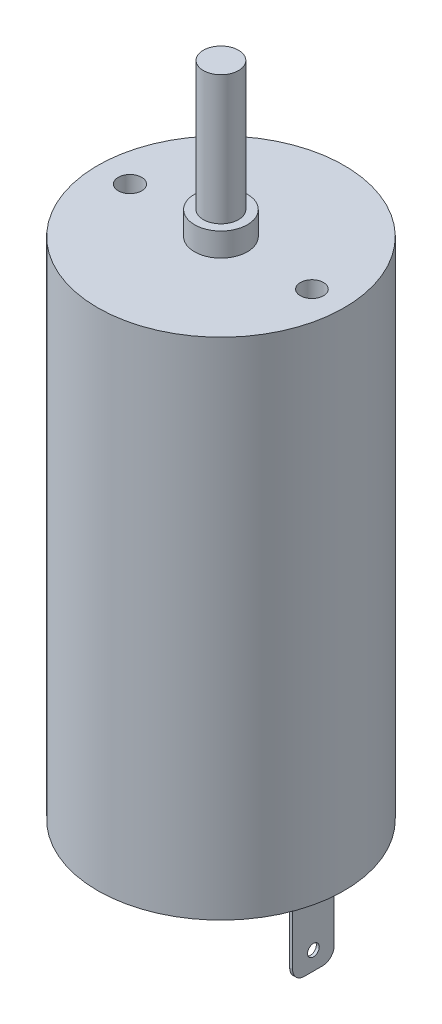
ISO-10303-21;
HEADER;
FILE_DESCRIPTION(('STEP AP214'),'2;1');
FILE_NAME('part.step','',(''),(''),'','','');
FILE_SCHEMA(('AUTOMOTIVE_DESIGN { 1 0 10303 214 1 1 1 1 }'));
ENDSEC;
DATA;
#1=APPLICATION_CONTEXT('core data for automotive mechanical design processes');
#2=APPLICATION_PROTOCOL_DEFINITION('international standard','automotive_design',2000,#1);
#3=PRODUCT_CONTEXT('',#1,'mechanical');
#4=PRODUCT('Part','Part','',(#3));
#5=PRODUCT_RELATED_PRODUCT_CATEGORY('part','',(#4));
#6=PRODUCT_DEFINITION_FORMATION('','',#4);
#7=PRODUCT_DEFINITION_CONTEXT('part definition',#1,'design');
#8=PRODUCT_DEFINITION('design','',#6,#7);
#9=PRODUCT_DEFINITION_SHAPE('','',#8);
#10=(LENGTH_UNIT() NAMED_UNIT(*) SI_UNIT(.MILLI.,.METRE.));
#11=(NAMED_UNIT(*) PLANE_ANGLE_UNIT() SI_UNIT($,.RADIAN.));
#12=(NAMED_UNIT(*) SI_UNIT($,.STERADIAN.) SOLID_ANGLE_UNIT());
#13=UNCERTAINTY_MEASURE_WITH_UNIT(LENGTH_MEASURE(1.E-05),#10,'distance_accuracy_value','');
#14=(GEOMETRIC_REPRESENTATION_CONTEXT(3) GLOBAL_UNCERTAINTY_ASSIGNED_CONTEXT((#13)) GLOBAL_UNIT_ASSIGNED_CONTEXT((#10,
#11,#12)) REPRESENTATION_CONTEXT('',''));
#15=CARTESIAN_POINT('',(0.,0.,0.));
#16=DIRECTION('',(0.,0.,1.));
#17=DIRECTION('',(1.,0.,0.));
#18=AXIS2_PLACEMENT_3D('',#15,#16,#17);
#19=CARTESIAN_POINT('',(0.,-1.25,0.));
#20=DIRECTION('',(0.,-1.,0.));
#21=DIRECTION('',(0.,0.,-1.));
#22=AXIS2_PLACEMENT_3D('',#19,#20,#21);
#23=PLANE('',#22);
#24=DIRECTION('',(-1.,0.,0.));
#25=VECTOR('',#24,1.);
#26=CARTESIAN_POINT('',(7.625,-1.25,1.77));
#27=LINE('',#26,#25);
#28=CARTESIAN_POINT('',(7.875,-1.25,1.77));
#29=VERTEX_POINT('',#28);
#30=CARTESIAN_POINT('',(7.625,-1.25,1.77));
#31=VERTEX_POINT('',#30);
#32=EDGE_CURVE('E192',#29,#31,#27,.T.);
#33=ORIENTED_EDGE('',*,*,#32,.F.);
#34=DIRECTION('',(0.,0.,1.));
#35=VECTOR('',#34,1.);
#36=CARTESIAN_POINT('',(7.875,-1.25,-2.));
#37=LINE('',#36,#35);
#38=CARTESIAN_POINT('',(7.875,-1.25,2.));
#39=VERTEX_POINT('',#38);
#40=EDGE_CURVE('E188',#29,#39,#37,.T.);
#41=ORIENTED_EDGE('',*,*,#40,.T.);
#42=DIRECTION('',(-1.,0.,0.));
#43=VECTOR('',#42,1.);
#44=CARTESIAN_POINT('',(7.875,-1.25,2.));
#45=LINE('',#44,#43);
#46=CARTESIAN_POINT('',(7.625,-1.25,2.));
#47=VERTEX_POINT('',#46);
#48=EDGE_CURVE('E187',#39,#47,#45,.T.);
#49=ORIENTED_EDGE('',*,*,#48,.T.);
#50=DIRECTION('',(0.,0.,-1.));
#51=VECTOR('',#50,1.);
#52=CARTESIAN_POINT('',(7.625,-1.25,-2.));
#53=LINE('',#52,#51);
#54=EDGE_CURVE('E270',#47,#31,#53,.T.);
#55=ORIENTED_EDGE('',*,*,#54,.T.);
#56=EDGE_LOOP('',(#33,#41,#49,#55));
#57=FACE_BOUND('',#56,.T.);
#58=ADVANCED_FACE('F33',(#57),#23,.T.);
#59=CARTESIAN_POINT('',(0.,-1.25,0.));
#60=DIRECTION('',(0.,-1.,0.));
#61=DIRECTION('',(0.,0.,-1.));
#62=AXIS2_PLACEMENT_3D('',#59,#60,#61);
#63=PLANE('',#62);
#64=DIRECTION('',(1.,0.,0.));
#65=VECTOR('',#64,1.);
#66=CARTESIAN_POINT('',(-7.625,-1.25,-1.775));
#67=LINE('',#66,#65);
#68=CARTESIAN_POINT('',(-7.875,-1.25,-1.775));
#69=VERTEX_POINT('',#68);
#70=CARTESIAN_POINT('',(-7.625,-1.25,-1.775));
#71=VERTEX_POINT('',#70);
#72=EDGE_CURVE('E217',#69,#71,#67,.T.);
#73=ORIENTED_EDGE('',*,*,#72,.F.);
#74=DIRECTION('',(0.,0.,-1.));
#75=VECTOR('',#74,1.);
#76=CARTESIAN_POINT('',(-7.875,-1.25,-2.));
#77=LINE('',#76,#75);
#78=CARTESIAN_POINT('',(-7.875,-1.25,-2.));
#79=VERTEX_POINT('',#78);
#80=EDGE_CURVE('E238',#69,#79,#77,.T.);
#81=ORIENTED_EDGE('',*,*,#80,.T.);
#82=DIRECTION('',(1.,0.,0.));
#83=VECTOR('',#82,1.);
#84=CARTESIAN_POINT('',(-7.625,-1.25,-2.));
#85=LINE('',#84,#83);
#86=CARTESIAN_POINT('',(-7.625,-1.25,-2.));
#87=VERTEX_POINT('',#86);
#88=EDGE_CURVE('E237',#79,#87,#85,.T.);
#89=ORIENTED_EDGE('',*,*,#88,.T.);
#90=DIRECTION('',(0.,0.,1.));
#91=VECTOR('',#90,1.);
#92=CARTESIAN_POINT('',(-7.625,-1.25,-2.));
#93=LINE('',#92,#91);
#94=EDGE_CURVE('E241',#87,#71,#93,.T.);
#95=ORIENTED_EDGE('',*,*,#94,.T.);
#96=EDGE_LOOP('',(#73,#81,#89,#95));
#97=FACE_BOUND('',#96,.T.);
#98=ADVANCED_FACE('F399',(#97),#63,.T.);
#99=CARTESIAN_POINT('',(0.,0.,0.));
#100=DIRECTION('',(0.,1.,0.));
#101=DIRECTION('',(0.,0.,1.));
#102=AXIS2_PLACEMENT_3D('',#99,#100,#101);
#103=PLANE('',#102);
#104=DIRECTION('',(0.,0.,-1.));
#105=VECTOR('',#104,1.);
#106=CARTESIAN_POINT('',(7.625,0.,-2.));
#107=LINE('',#106,#105);
#108=CARTESIAN_POINT('',(7.625,0.,2.));
#109=VERTEX_POINT('',#108);
#110=CARTESIAN_POINT('',(7.625,0.,-2.));
#111=VERTEX_POINT('',#110);
#112=EDGE_CURVE('E269',#109,#111,#107,.T.);
#113=ORIENTED_EDGE('',*,*,#112,.F.);
#114=DIRECTION('',(-1.,0.,0.));
#115=VECTOR('',#114,1.);
#116=CARTESIAN_POINT('',(7.875,0.,2.));
#117=LINE('',#116,#115);
#118=CARTESIAN_POINT('',(7.875,0.,2.));
#119=VERTEX_POINT('',#118);
#120=EDGE_CURVE('E285',#119,#109,#117,.T.);
#121=ORIENTED_EDGE('',*,*,#120,.F.);
#122=DIRECTION('',(0.,0.,1.));
#123=VECTOR('',#122,1.);
#124=CARTESIAN_POINT('',(7.875,0.,-2.));
#125=LINE('',#124,#123);
#126=CARTESIAN_POINT('',(7.875,0.,-2.));
#127=VERTEX_POINT('',#126);
#128=EDGE_CURVE('E282',#127,#119,#125,.T.);
#129=ORIENTED_EDGE('',*,*,#128,.F.);
#130=DIRECTION('',(1.,0.,0.));
#131=VECTOR('',#130,1.);
#132=CARTESIAN_POINT('',(7.875,0.,-2.));
#133=LINE('',#132,#131);
#134=EDGE_CURVE('E279',#111,#127,#133,.T.);
#135=ORIENTED_EDGE('',*,*,#134,.F.);
#136=EDGE_LOOP('',(#113,#121,#129,#135));
#137=FACE_BOUND('',#136,.T.);
#138=CARTESIAN_POINT('',(0.,0.,0.));
#139=DIRECTION('',(0.,1.,0.));
#140=DIRECTION('',(0.,0.,1.));
#141=AXIS2_PLACEMENT_3D('',#138,#139,#140);
#142=CIRCLE('',#141,10.5);
#143=CARTESIAN_POINT('',(0.,0.,10.5));
#144=VERTEX_POINT('',#143);
#145=EDGE_CURVE('E320',#144,#144,#142,.T.);
#146=ORIENTED_EDGE('',*,*,#145,.F.);
#147=EDGE_LOOP('',(#146));
#148=FACE_BOUND('',#147,.T.);
#149=DIRECTION('',(0.,0.,-1.));
#150=VECTOR('',#149,1.);
#151=CARTESIAN_POINT('',(-7.875,0.,-2.));
#152=LINE('',#151,#150);
#153=CARTESIAN_POINT('',(-7.875,0.,2.));
#154=VERTEX_POINT('',#153);
#155=CARTESIAN_POINT('',(-7.875,0.,-2.));
#156=VERTEX_POINT('',#155);
#157=EDGE_CURVE('E233',#154,#156,#152,.T.);
#158=ORIENTED_EDGE('',*,*,#157,.F.);
#159=DIRECTION('',(-1.,0.,0.));
#160=VECTOR('',#159,1.);
#161=CARTESIAN_POINT('',(-7.625,0.,2.));
#162=LINE('',#161,#160);
#163=CARTESIAN_POINT('',(-7.625,0.,2.));
#164=VERTEX_POINT('',#163);
#165=EDGE_CURVE('E255',#164,#154,#162,.T.);
#166=ORIENTED_EDGE('',*,*,#165,.F.);
#167=DIRECTION('',(0.,0.,1.));
#168=VECTOR('',#167,1.);
#169=CARTESIAN_POINT('',(-7.625,0.,-2.));
#170=LINE('',#169,#168);
#171=CARTESIAN_POINT('',(-7.625,0.,-2.));
#172=VERTEX_POINT('',#171);
#173=EDGE_CURVE('E252',#172,#164,#170,.T.);
#174=ORIENTED_EDGE('',*,*,#173,.F.);
#175=DIRECTION('',(1.,0.,0.));
#176=VECTOR('',#175,1.);
#177=CARTESIAN_POINT('',(-7.625,0.,-2.));
#178=LINE('',#177,#176);
#179=EDGE_CURVE('E249',#156,#172,#178,.T.);
#180=ORIENTED_EDGE('',*,*,#179,.F.);
#181=EDGE_LOOP('',(#158,#166,#174,#180));
#182=FACE_BOUND('',#181,.T.);
#183=ADVANCED_FACE('F383',(#137,#148,#182),#103,.F.);
#184=CARTESIAN_POINT('',(0.,43.,0.));
#185=DIRECTION('',(0.,-1.,0.));
#186=DIRECTION('',(0.,0.,-1.));
#187=AXIS2_PLACEMENT_3D('',#184,#185,#186);
#188=CYLINDRICAL_SURFACE('',#187,10.5);
#189=CARTESIAN_POINT('',(0.,43.,0.));
#190=DIRECTION('',(0.,1.,0.));
#191=DIRECTION('',(0.,0.,1.));
#192=AXIS2_PLACEMENT_3D('',#189,#190,#191);
#193=CIRCLE('',#192,10.5);
#194=CARTESIAN_POINT('',(0.,43.,10.5));
#195=VERTEX_POINT('',#194);
#196=EDGE_CURVE('E321',#195,#195,#193,.T.);
#197=ORIENTED_EDGE('',*,*,#196,.F.);
#198=EDGE_LOOP('',(#197));
#199=FACE_BOUND('',#198,.T.);
#200=ORIENTED_EDGE('',*,*,#145,.T.);
#201=EDGE_LOOP('',(#200));
#202=FACE_BOUND('',#201,.T.);
#203=ADVANCED_FACE('F606',(#199,#202),#188,.T.);
#204=CARTESIAN_POINT('',(0.,43.,0.));
#205=DIRECTION('',(0.,1.,0.));
#206=DIRECTION('',(0.,0.,1.));
#207=AXIS2_PLACEMENT_3D('',#204,#205,#206);
#208=PLANE('',#207);
#209=CARTESIAN_POINT('',(7.75,43.,0.));
#210=DIRECTION('',(0.,1.,0.));
#211=DIRECTION('',(0.,0.,1.));
#212=AXIS2_PLACEMENT_3D('',#209,#210,#211);
#213=CIRCLE('',#212,0.983949460404674);
#214=CARTESIAN_POINT('',(7.75,43.,0.983949460404674));
#215=VERTEX_POINT('',#214);
#216=EDGE_CURVE('E303',#215,#215,#213,.T.);
#217=ORIENTED_EDGE('',*,*,#216,.F.);
#218=EDGE_LOOP('',(#217));
#219=FACE_BOUND('',#218,.T.);
#220=CARTESIAN_POINT('',(-7.75,43.,0.));
#221=DIRECTION('',(0.,1.,0.));
#222=DIRECTION('',(0.,0.,1.));
#223=AXIS2_PLACEMENT_3D('',#220,#221,#222);
#224=CIRCLE('',#223,1.);
#225=CARTESIAN_POINT('',(-7.75,43.,1.));
#226=VERTEX_POINT('',#225);
#227=EDGE_CURVE('E298',#226,#226,#224,.T.);
#228=ORIENTED_EDGE('',*,*,#227,.F.);
#229=EDGE_LOOP('',(#228));
#230=FACE_BOUND('',#229,.T.);
#231=CARTESIAN_POINT('',(0.,43.,0.));
#232=DIRECTION('',(0.,1.,0.));
#233=DIRECTION('',(0.,0.,1.));
#234=AXIS2_PLACEMENT_3D('',#231,#232,#233);
#235=CIRCLE('',#234,2.25);
#236=CARTESIAN_POINT('',(0.,43.,2.25));
#237=VERTEX_POINT('',#236);
#238=EDGE_CURVE('E302',#237,#237,#235,.T.);
#239=ORIENTED_EDGE('',*,*,#238,.F.);
#240=EDGE_LOOP('',(#239));
#241=FACE_BOUND('',#240,.T.);
#242=ORIENTED_EDGE('',*,*,#196,.T.);
#243=EDGE_LOOP('',(#242));
#244=FACE_BOUND('',#243,.T.);
#245=ADVANCED_FACE('F651',(#219,#230,#241,#244),#208,.T.);
#246=CARTESIAN_POINT('',(0.,45.,0.));
#247=DIRECTION('',(0.,-1.,0.));
#248=DIRECTION('',(0.,0.,-1.));
#249=AXIS2_PLACEMENT_3D('',#246,#247,#248);
#250=CYLINDRICAL_SURFACE('',#249,2.25);
#251=CARTESIAN_POINT('',(0.,45.,0.));
#252=DIRECTION('',(0.,1.,0.));
#253=DIRECTION('',(0.,0.,1.));
#254=AXIS2_PLACEMENT_3D('',#251,#252,#253);
#255=CIRCLE('',#254,2.25);
#256=CARTESIAN_POINT('',(0.,45.,2.25));
#257=VERTEX_POINT('',#256);
#258=EDGE_CURVE('E311',#257,#257,#255,.T.);
#259=ORIENTED_EDGE('',*,*,#258,.F.);
#260=EDGE_LOOP('',(#259));
#261=FACE_BOUND('',#260,.T.);
#262=ORIENTED_EDGE('',*,*,#238,.T.);
#263=EDGE_LOOP('',(#262));
#264=FACE_BOUND('',#263,.T.);
#265=ADVANCED_FACE('F656',(#261,#264),#250,.T.);
#266=CARTESIAN_POINT('',(0.,45.,0.));
#267=DIRECTION('',(0.,1.,0.));
#268=DIRECTION('',(0.,0.,1.));
#269=AXIS2_PLACEMENT_3D('',#266,#267,#268);
#270=PLANE('',#269);
#271=CARTESIAN_POINT('',(0.,45.,0.));
#272=DIRECTION('',(0.,1.,0.));
#273=DIRECTION('',(0.,0.,1.));
#274=AXIS2_PLACEMENT_3D('',#271,#272,#273);
#275=CIRCLE('',#274,1.5);
#276=CARTESIAN_POINT('',(0.,45.,-1.5));
#277=VERTEX_POINT('',#276);
#278=EDGE_CURVE('E314',#277,#277,#275,.T.);
#279=ORIENTED_EDGE('',*,*,#278,.F.);
#280=EDGE_LOOP('',(#279));
#281=FACE_BOUND('',#280,.T.);
#282=ORIENTED_EDGE('',*,*,#258,.T.);
#283=EDGE_LOOP('',(#282));
#284=FACE_BOUND('',#283,.T.);
#285=ADVANCED_FACE('F675',(#281,#284),#270,.T.);
#286=CARTESIAN_POINT('',(0.,56.,0.));
#287=DIRECTION('',(0.,1.,0.));
#288=DIRECTION('',(0.,0.,1.));
#289=AXIS2_PLACEMENT_3D('',#286,#287,#288);
#290=PLANE('',#289);
#291=CARTESIAN_POINT('',(0.,56.,0.));
#292=DIRECTION('',(0.,1.,0.));
#293=DIRECTION('',(0.,0.,1.));
#294=AXIS2_PLACEMENT_3D('',#291,#292,#293);
#295=CIRCLE('',#294,1.5);
#296=CARTESIAN_POINT('',(0.,56.,-1.5));
#297=VERTEX_POINT('',#296);
#298=EDGE_CURVE('E317',#297,#297,#295,.T.);
#299=ORIENTED_EDGE('',*,*,#298,.T.);
#300=EDGE_LOOP('',(#299));
#301=FACE_BOUND('',#300,.T.);
#302=ADVANCED_FACE('F667',(#301),#290,.T.);
#303=CARTESIAN_POINT('',(0.,56.,0.));
#304=DIRECTION('',(0.,-1.,0.));
#305=DIRECTION('',(0.,0.,-1.));
#306=AXIS2_PLACEMENT_3D('',#303,#304,#305);
#307=CYLINDRICAL_SURFACE('',#306,1.5);
#308=CARTESIAN_POINT('',(0.,45.,-1.5));
#309=CARTESIAN_POINT('',(0.,45.1145833333333,-1.5));
#310=CARTESIAN_POINT('',(0.,45.2291666666667,-1.5));
#311=CARTESIAN_POINT('',(0.,45.4583333333333,-1.5));
#312=CARTESIAN_POINT('',(0.,45.5729166666667,-1.5));
#313=CARTESIAN_POINT('',(0.,45.8020833333333,-1.5));
#314=CARTESIAN_POINT('',(0.,45.9166666666667,-1.5));
#315=CARTESIAN_POINT('',(0.,46.1458333333333,-1.5));
#316=CARTESIAN_POINT('',(0.,46.2604166666667,-1.5));
#317=CARTESIAN_POINT('',(0.,46.4895833333333,-1.5));
#318=CARTESIAN_POINT('',(0.,46.6041666666667,-1.5));
#319=CARTESIAN_POINT('',(0.,46.8333333333333,-1.5));
#320=CARTESIAN_POINT('',(0.,46.9479166666667,-1.5));
#321=CARTESIAN_POINT('',(0.,47.1770833333333,-1.5));
#322=CARTESIAN_POINT('',(0.,47.2916666666667,-1.5));
#323=CARTESIAN_POINT('',(0.,47.5208333333333,-1.5));
#324=CARTESIAN_POINT('',(0.,47.6354166666667,-1.5));
#325=CARTESIAN_POINT('',(0.,47.8645833333333,-1.5));
#326=CARTESIAN_POINT('',(0.,47.9791666666667,-1.5));
#327=CARTESIAN_POINT('',(0.,48.2083333333333,-1.5));
#328=CARTESIAN_POINT('',(0.,48.3229166666667,-1.5));
#329=CARTESIAN_POINT('',(0.,48.5520833333333,-1.5));
#330=CARTESIAN_POINT('',(0.,48.6666666666667,-1.5));
#331=CARTESIAN_POINT('',(0.,48.8958333333333,-1.5));
#332=CARTESIAN_POINT('',(0.,49.0104166666667,-1.5));
#333=CARTESIAN_POINT('',(0.,49.2395833333333,-1.5));
#334=CARTESIAN_POINT('',(0.,49.3541666666667,-1.5));
#335=CARTESIAN_POINT('',(0.,49.5833333333333,-1.5));
#336=CARTESIAN_POINT('',(0.,49.6979166666667,-1.5));
#337=CARTESIAN_POINT('',(0.,49.9270833333333,-1.5));
#338=CARTESIAN_POINT('',(0.,50.0416666666667,-1.5));
#339=CARTESIAN_POINT('',(0.,50.2708333333333,-1.5));
#340=CARTESIAN_POINT('',(0.,50.3854166666667,-1.5));
#341=CARTESIAN_POINT('',(0.,50.6145833333333,-1.5));
#342=CARTESIAN_POINT('',(0.,50.7291666666667,-1.5));
#343=CARTESIAN_POINT('',(0.,50.9583333333333,-1.5));
#344=CARTESIAN_POINT('',(0.,51.0729166666667,-1.5));
#345=CARTESIAN_POINT('',(0.,51.3020833333333,-1.5));
#346=CARTESIAN_POINT('',(0.,51.4166666666667,-1.5));
#347=CARTESIAN_POINT('',(0.,51.6458333333333,-1.5));
#348=CARTESIAN_POINT('',(0.,51.7604166666667,-1.5));
#349=CARTESIAN_POINT('',(0.,51.9895833333333,-1.5));
#350=CARTESIAN_POINT('',(0.,52.1041666666667,-1.5));
#351=CARTESIAN_POINT('',(0.,52.3333333333333,-1.5));
#352=CARTESIAN_POINT('',(0.,52.4479166666667,-1.5));
#353=CARTESIAN_POINT('',(0.,52.6770833333333,-1.5));
#354=CARTESIAN_POINT('',(0.,52.7916666666667,-1.5));
#355=CARTESIAN_POINT('',(0.,53.0208333333333,-1.5));
#356=CARTESIAN_POINT('',(0.,53.1354166666667,-1.5));
#357=CARTESIAN_POINT('',(0.,53.3645833333333,-1.5));
#358=CARTESIAN_POINT('',(0.,53.4791666666667,-1.5));
#359=CARTESIAN_POINT('',(0.,53.7083333333333,-1.5));
#360=CARTESIAN_POINT('',(0.,53.8229166666667,-1.5));
#361=CARTESIAN_POINT('',(0.,54.0520833333333,-1.5));
#362=CARTESIAN_POINT('',(0.,54.1666666666667,-1.5));
#363=CARTESIAN_POINT('',(0.,54.3958333333333,-1.5));
#364=CARTESIAN_POINT('',(0.,54.5104166666667,-1.5));
#365=CARTESIAN_POINT('',(0.,54.7395833333333,-1.5));
#366=CARTESIAN_POINT('',(0.,54.8541666666667,-1.5));
#367=CARTESIAN_POINT('',(0.,55.0833333333333,-1.5));
#368=CARTESIAN_POINT('',(0.,55.1979166666667,-1.5));
#369=CARTESIAN_POINT('',(0.,55.4270833333333,-1.5));
#370=CARTESIAN_POINT('',(0.,55.5416666666667,-1.5));
#371=CARTESIAN_POINT('',(0.,55.7708333333333,-1.5));
#372=CARTESIAN_POINT('',(0.,55.8854166666667,-1.5));
#373=CARTESIAN_POINT('',(0.,56.,-1.5));
#374=B_SPLINE_CURVE_WITH_KNOTS('',3,(#308,#309,#310,#311,#312,#313,#314,#315,#316,#317,#318,
#319,#320,#321,#322,#323,#324,#325,#326,#327,#328,#329,#330,#331,#332,#333,#334,#335,#336,#337,
#338,#339,#340,#341,#342,#343,#344,#345,#346,#347,#348,#349,#350,#351,#352,#353,#354,#355,#356,
#357,#358,#359,#360,#361,#362,#363,#364,#365,#366,#367,#368,#369,#370,#371,#372,#373),
.UNSPECIFIED.,.F.,.F.,(4,2,2,2,2,2,2,2,2,2,2,2,2,2,2,2,2,2,2,2,2,2,2,2,2,2,2,2,2,2,2,2,4),(0.,
0.343750000000004,0.687500000000001,1.03125,1.375,1.71875,2.0625,2.40625000000001,2.75,3.09375,
3.4375,3.78125,4.125,4.46875,4.8125,5.15625,5.5,5.84375,6.1875,6.53125,6.875,7.21875,7.5625,
7.90625,8.25,8.59375,8.9375,9.28125,9.625,9.96875,10.3125,10.65625,11.),.UNSPECIFIED.);
#375=EDGE_CURVE('BSEAM643',#277,#297,#374,.T.);
#376=ORIENTED_EDGE('',*,*,#278,.T.);
#377=ORIENTED_EDGE('',*,*,#298,.F.);
#378=ORIENTED_EDGE('',*,*,#375,.T.);
#379=ORIENTED_EDGE('',*,*,#375,.F.);
#380=EDGE_LOOP('',(#376,#378,#377,#379));
#381=FACE_BOUND('',#380,.T.);
#382=ADVANCED_FACE('F643',(#381),#307,.T.);
#383=CARTESIAN_POINT('',(-7.75,35.5,0.));
#384=DIRECTION('',(0.,1.,0.));
#385=DIRECTION('',(0.,0.,1.));
#386=AXIS2_PLACEMENT_3D('',#383,#384,#385);
#387=CYLINDRICAL_SURFACE('',#386,1.);
#388=CARTESIAN_POINT('',(-7.75,35.5,0.));
#389=DIRECTION('',(0.,1.,0.));
#390=DIRECTION('',(0.,0.,1.));
#391=AXIS2_PLACEMENT_3D('',#388,#389,#390);
#392=CIRCLE('',#391,1.);
#393=CARTESIAN_POINT('',(-7.75,35.5,1.));
#394=VERTEX_POINT('',#393);
#395=EDGE_CURVE('E306',#394,#394,#392,.T.);
#396=ORIENTED_EDGE('',*,*,#395,.F.);
#397=EDGE_LOOP('',(#396));
#398=FACE_BOUND('',#397,.T.);
#399=ORIENTED_EDGE('',*,*,#227,.T.);
#400=EDGE_LOOP('',(#399));
#401=FACE_BOUND('',#400,.T.);
#402=ADVANCED_FACE('F633',(#398,#401),#387,.F.);
#403=CARTESIAN_POINT('',(-7.75,35.5,0.));
#404=DIRECTION('',(0.,1.,0.));
#405=DIRECTION('',(0.,0.,1.));
#406=AXIS2_PLACEMENT_3D('',#403,#404,#405);
#407=PLANE('',#406);
#408=ORIENTED_EDGE('',*,*,#395,.T.);
#409=EDGE_LOOP('',(#408));
#410=FACE_BOUND('',#409,.T.);
#411=ADVANCED_FACE('F623',(#410),#407,.T.);
#412=CARTESIAN_POINT('',(7.75,35.5,0.));
#413=DIRECTION('',(0.,1.,0.));
#414=DIRECTION('',(0.,0.,1.));
#415=AXIS2_PLACEMENT_3D('',#412,#413,#414);
#416=CYLINDRICAL_SURFACE('',#415,0.983949460404674);
#417=CARTESIAN_POINT('',(7.75,35.5,0.));
#418=DIRECTION('',(0.,1.,0.));
#419=DIRECTION('',(0.,0.,1.));
#420=AXIS2_PLACEMENT_3D('',#417,#418,#419);
#421=CIRCLE('',#420,0.983949460404674);
#422=CARTESIAN_POINT('',(7.75,35.5,0.983949460404674));
#423=VERTEX_POINT('',#422);
#424=EDGE_CURVE('E299',#423,#423,#421,.T.);
#425=ORIENTED_EDGE('',*,*,#424,.F.);
#426=EDGE_LOOP('',(#425));
#427=FACE_BOUND('',#426,.T.);
#428=ORIENTED_EDGE('',*,*,#216,.T.);
#429=EDGE_LOOP('',(#428));
#430=FACE_BOUND('',#429,.T.);
#431=ADVANCED_FACE('F613',(#427,#430),#416,.F.);
#432=CARTESIAN_POINT('',(7.75,35.5,0.));
#433=DIRECTION('',(0.,1.,0.));
#434=DIRECTION('',(0.,0.,1.));
#435=AXIS2_PLACEMENT_3D('',#432,#433,#434);
#436=PLANE('',#435);
#437=ORIENTED_EDGE('',*,*,#424,.T.);
#438=EDGE_LOOP('',(#437));
#439=FACE_BOUND('',#438,.T.);
#440=ADVANCED_FACE('F395',(#439),#436,.T.);
#441=CARTESIAN_POINT('',(7.625,-1.25,-2.));
#442=DIRECTION('',(1.,0.,0.));
#443=DIRECTION('',(0.,0.,-1.));
#444=AXIS2_PLACEMENT_3D('',#441,#442,#443);
#445=PLANE('',#444);
#446=CARTESIAN_POINT('',(7.625,-5.7,0.));
#447=DIRECTION('',(1.,0.,0.));
#448=DIRECTION('',(0.,0.,-1.));
#449=AXIS2_PLACEMENT_3D('',#446,#447,#448);
#450=CIRCLE('',#449,0.5);
#451=CARTESIAN_POINT('',(7.625,-5.7,-0.5));
#452=VERTEX_POINT('',#451);
#453=EDGE_CURVE('E193',#452,#452,#450,.T.);
#454=ORIENTED_EDGE('',*,*,#453,.T.);
#455=EDGE_LOOP('',(#454));
#456=FACE_BOUND('',#455,.T.);
#457=DIRECTION('',(0.,0.,-1.));
#458=VECTOR('',#457,1.);
#459=CARTESIAN_POINT('',(7.625,-7.25,-1.77));
#460=LINE('',#459,#458);
#461=CARTESIAN_POINT('',(7.625,-7.25,0.77));
#462=VERTEX_POINT('',#461);
#463=CARTESIAN_POINT('',(7.625,-7.25,-0.77));
#464=VERTEX_POINT('',#463);
#465=EDGE_CURVE('E196',#462,#464,#460,.T.);
#466=ORIENTED_EDGE('',*,*,#465,.F.);
#467=CARTESIAN_POINT('',(7.625,-6.25,0.77));
#468=DIRECTION('',(1.,0.,0.));
#469=DIRECTION('',(0.,0.,-1.));
#470=AXIS2_PLACEMENT_3D('',#467,#468,#469);
#471=CIRCLE('',#470,1.);
#472=CARTESIAN_POINT('',(7.625,-6.25,1.77));
#473=VERTEX_POINT('',#472);
#474=EDGE_CURVE('E356',#462,#473,#471,.F.);
#475=ORIENTED_EDGE('',*,*,#474,.T.);
#476=DIRECTION('',(0.,1.,0.));
#477=VECTOR('',#476,1.);
#478=CARTESIAN_POINT('',(7.625,-7.25,1.77));
#479=LINE('',#478,#477);
#480=EDGE_CURVE('E205',#473,#31,#479,.T.);
#481=ORIENTED_EDGE('',*,*,#480,.T.);
#482=ORIENTED_EDGE('',*,*,#54,.F.);
#483=DIRECTION('',(0.,1.,0.));
#484=VECTOR('',#483,1.);
#485=CARTESIAN_POINT('',(7.625,-1.25,2.));
#486=LINE('',#485,#484);
#487=EDGE_CURVE('E276',#47,#109,#486,.T.);
#488=ORIENTED_EDGE('',*,*,#487,.T.);
#489=ORIENTED_EDGE('',*,*,#112,.T.);
#490=DIRECTION('',(0.,1.,0.));
#491=VECTOR('',#490,1.);
#492=CARTESIAN_POINT('',(7.625,-1.25,-2.));
#493=LINE('',#492,#491);
#494=CARTESIAN_POINT('',(7.625,-1.25,-2.));
#495=VERTEX_POINT('',#494);
#496=EDGE_CURVE('E295',#495,#111,#493,.T.);
#497=ORIENTED_EDGE('',*,*,#496,.F.);
#498=CARTESIAN_POINT('',(7.625,-1.25,-1.77));
#499=VERTEX_POINT('',#498);
#500=EDGE_CURVE('E273',#499,#495,#53,.T.);
#501=ORIENTED_EDGE('',*,*,#500,.F.);
#502=DIRECTION('',(0.,1.,0.));
#503=VECTOR('',#502,1.);
#504=CARTESIAN_POINT('',(7.625,-7.25,-1.77));
#505=LINE('',#504,#503);
#506=CARTESIAN_POINT('',(7.625,-6.25,-1.77));
#507=VERTEX_POINT('',#506);
#508=EDGE_CURVE('E176',#507,#499,#505,.T.);
#509=ORIENTED_EDGE('',*,*,#508,.F.);
#510=CARTESIAN_POINT('',(7.625,-6.25,-0.77));
#511=DIRECTION('',(1.,0.,0.));
#512=DIRECTION('',(0.,0.,-1.));
#513=AXIS2_PLACEMENT_3D('',#510,#511,#512);
#514=CIRCLE('',#513,1.);
#515=EDGE_CURVE('E354',#507,#464,#514,.F.);
#516=ORIENTED_EDGE('',*,*,#515,.T.);
#517=EDGE_LOOP('',(#466,#475,#481,#482,#488,#489,#497,#501,#509,#516));
#518=FACE_BOUND('',#517,.T.);
#519=ADVANCED_FACE('F371',(#456,#518),#445,.F.);
#520=CARTESIAN_POINT('',(7.875,-1.25,-2.));
#521=DIRECTION('',(0.,0.,1.));
#522=DIRECTION('',(1.,0.,0.));
#523=AXIS2_PLACEMENT_3D('',#520,#521,#522);
#524=PLANE('',#523);
#525=ORIENTED_EDGE('',*,*,#134,.T.);
#526=DIRECTION('',(0.,1.,0.));
#527=VECTOR('',#526,1.);
#528=CARTESIAN_POINT('',(7.875,-1.25,-2.));
#529=LINE('',#528,#527);
#530=CARTESIAN_POINT('',(7.875,-1.25,-2.));
#531=VERTEX_POINT('',#530);
#532=EDGE_CURVE('E293',#531,#127,#529,.T.);
#533=ORIENTED_EDGE('',*,*,#532,.F.);
#534=DIRECTION('',(1.,0.,0.));
#535=VECTOR('',#534,1.);
#536=CARTESIAN_POINT('',(7.875,-1.25,-2.));
#537=LINE('',#536,#535);
#538=EDGE_CURVE('E185',#495,#531,#537,.T.);
#539=ORIENTED_EDGE('',*,*,#538,.F.);
#540=ORIENTED_EDGE('',*,*,#496,.T.);
#541=EDGE_LOOP('',(#525,#533,#539,#540));
#542=FACE_BOUND('',#541,.T.);
#543=ADVANCED_FACE('F386',(#542),#524,.F.);
#544=CARTESIAN_POINT('',(7.875,-1.25,-2.));
#545=DIRECTION('',(-1.,0.,0.));
#546=DIRECTION('',(0.,0.,1.));
#547=AXIS2_PLACEMENT_3D('',#544,#545,#546);
#548=PLANE('',#547);
#549=CARTESIAN_POINT('',(7.875,-5.7,0.));
#550=DIRECTION('',(1.,0.,0.));
#551=DIRECTION('',(0.,0.,-1.));
#552=AXIS2_PLACEMENT_3D('',#549,#550,#551);
#553=CIRCLE('',#552,0.5);
#554=CARTESIAN_POINT('',(7.875,-5.7,-0.5));
#555=VERTEX_POINT('',#554);
#556=EDGE_CURVE('E199',#555,#555,#553,.T.);
#557=ORIENTED_EDGE('',*,*,#556,.F.);
#558=EDGE_LOOP('',(#557));
#559=FACE_BOUND('',#558,.T.);
#560=DIRECTION('',(0.,1.,0.));
#561=VECTOR('',#560,1.);
#562=CARTESIAN_POINT('',(7.875,-7.25,1.77));
#563=LINE('',#562,#561);
#564=CARTESIAN_POINT('',(7.875,-6.25,1.77));
#565=VERTEX_POINT('',#564);
#566=EDGE_CURVE('E177',#565,#29,#563,.T.);
#567=ORIENTED_EDGE('',*,*,#566,.F.);
#568=CARTESIAN_POINT('',(7.875,-6.25,0.77));
#569=DIRECTION('',(-1.,0.,0.));
#570=DIRECTION('',(0.,0.,1.));
#571=AXIS2_PLACEMENT_3D('',#568,#569,#570);
#572=CIRCLE('',#571,1.);
#573=CARTESIAN_POINT('',(7.875,-7.25,0.77));
#574=VERTEX_POINT('',#573);
#575=EDGE_CURVE('E41',#565,#574,#572,.F.);
#576=ORIENTED_EDGE('',*,*,#575,.T.);
#577=DIRECTION('',(0.,0.,1.));
#578=VECTOR('',#577,1.);
#579=CARTESIAN_POINT('',(7.875,-7.25,-1.77));
#580=LINE('',#579,#578);
#581=CARTESIAN_POINT('',(7.875,-7.25,-0.77));
#582=VERTEX_POINT('',#581);
#583=EDGE_CURVE('E202',#582,#574,#580,.T.);
#584=ORIENTED_EDGE('',*,*,#583,.F.);
#585=CARTESIAN_POINT('',(7.875,-6.25,-0.77));
#586=DIRECTION('',(-1.,0.,0.));
#587=DIRECTION('',(0.,0.,1.));
#588=AXIS2_PLACEMENT_3D('',#585,#586,#587);
#589=CIRCLE('',#588,1.);
#590=CARTESIAN_POINT('',(7.875,-6.25,-1.77));
#591=VERTEX_POINT('',#590);
#592=EDGE_CURVE('E48',#582,#591,#589,.F.);
#593=ORIENTED_EDGE('',*,*,#592,.T.);
#594=DIRECTION('',(0.,1.,0.));
#595=VECTOR('',#594,1.);
#596=CARTESIAN_POINT('',(7.875,-7.25,-1.77));
#597=LINE('',#596,#595);
#598=CARTESIAN_POINT('',(7.875,-1.25,-1.77));
#599=VERTEX_POINT('',#598);
#600=EDGE_CURVE('E168',#591,#599,#597,.T.);
#601=ORIENTED_EDGE('',*,*,#600,.T.);
#602=EDGE_CURVE('E172',#531,#599,#37,.T.);
#603=ORIENTED_EDGE('',*,*,#602,.F.);
#604=ORIENTED_EDGE('',*,*,#532,.T.);
#605=ORIENTED_EDGE('',*,*,#128,.T.);
#606=DIRECTION('',(0.,1.,0.));
#607=VECTOR('',#606,1.);
#608=CARTESIAN_POINT('',(7.875,-1.25,2.));
#609=LINE('',#608,#607);
#610=EDGE_CURVE('E290',#39,#119,#609,.T.);
#611=ORIENTED_EDGE('',*,*,#610,.F.);
#612=ORIENTED_EDGE('',*,*,#40,.F.);
#613=EDGE_LOOP('',(#567,#576,#584,#593,#601,#603,#604,#605,#611,#612));
#614=FACE_BOUND('',#613,.T.);
#615=ADVANCED_FACE('F170',(#559,#614),#548,.F.);
#616=CARTESIAN_POINT('',(7.875,-1.25,2.));
#617=DIRECTION('',(0.,0.,-1.));
#618=DIRECTION('',(-1.,0.,0.));
#619=AXIS2_PLACEMENT_3D('',#616,#617,#618);
#620=PLANE('',#619);
#621=ORIENTED_EDGE('',*,*,#120,.T.);
#622=ORIENTED_EDGE('',*,*,#487,.F.);
#623=ORIENTED_EDGE('',*,*,#48,.F.);
#624=ORIENTED_EDGE('',*,*,#610,.T.);
#625=EDGE_LOOP('',(#621,#622,#623,#624));
#626=FACE_BOUND('',#625,.T.);
#627=ADVANCED_FACE('F380',(#626),#620,.F.);
#628=DIRECTION('',(1.,0.,0.));
#629=VECTOR('',#628,1.);
#630=CARTESIAN_POINT('',(7.625,-1.25,-1.77));
#631=LINE('',#630,#629);
#632=EDGE_CURVE('E182',#499,#599,#631,.T.);
#633=ORIENTED_EDGE('',*,*,#632,.F.);
#634=ORIENTED_EDGE('',*,*,#500,.T.);
#635=ORIENTED_EDGE('',*,*,#538,.T.);
#636=ORIENTED_EDGE('',*,*,#602,.T.);
#637=EDGE_LOOP('',(#633,#634,#635,#636));
#638=FACE_BOUND('',#637,.T.);
#639=ADVANCED_FACE('F181',(#638),#23,.T.);
#640=CARTESIAN_POINT('',(-7.875,-1.25,-2.));
#641=DIRECTION('',(1.,0.,0.));
#642=DIRECTION('',(0.,0.,-1.));
#643=AXIS2_PLACEMENT_3D('',#640,#641,#642);
#644=PLANE('',#643);
#645=CARTESIAN_POINT('',(-7.875,-5.6962707678565,0.));
#646=DIRECTION('',(-1.,0.,0.));
#647=DIRECTION('',(0.,0.,1.));
#648=AXIS2_PLACEMENT_3D('',#645,#646,#647);
#649=CIRCLE('',#648,0.5);
#650=CARTESIAN_POINT('',(-7.875,-5.6962707678565,0.500000000000003));
#651=VERTEX_POINT('',#650);
#652=EDGE_CURVE('E209',#651,#651,#649,.T.);
#653=ORIENTED_EDGE('',*,*,#652,.F.);
#654=EDGE_LOOP('',(#653));
#655=FACE_BOUND('',#654,.T.);
#656=DIRECTION('',(0.,0.,-1.));
#657=VECTOR('',#656,1.);
#658=CARTESIAN_POINT('',(-7.875,-7.25,1.775));
#659=LINE('',#658,#657);
#660=CARTESIAN_POINT('',(-7.875,-7.25,0.774999999999999));
#661=VERTEX_POINT('',#660);
#662=CARTESIAN_POINT('',(-7.875,-7.25,-0.775000000000001));
#663=VERTEX_POINT('',#662);
#664=EDGE_CURVE('E216',#661,#663,#659,.T.);
#665=ORIENTED_EDGE('',*,*,#664,.F.);
#666=CARTESIAN_POINT('',(-7.875,-6.25,0.774999999999999));
#667=DIRECTION('',(1.,0.,0.));
#668=DIRECTION('',(0.,0.,-1.));
#669=AXIS2_PLACEMENT_3D('',#666,#667,#668);
#670=CIRCLE('',#669,1.);
#671=CARTESIAN_POINT('',(-7.875,-6.25,1.775));
#672=VERTEX_POINT('',#671);
#673=EDGE_CURVE('E336',#661,#672,#670,.F.);
#674=ORIENTED_EDGE('',*,*,#673,.T.);
#675=DIRECTION('',(0.,1.,0.));
#676=VECTOR('',#675,1.);
#677=CARTESIAN_POINT('',(-7.875,-7.25,1.775));
#678=LINE('',#677,#676);
#679=CARTESIAN_POINT('',(-7.875,-1.25,1.775));
#680=VERTEX_POINT('',#679);
#681=EDGE_CURVE('E229',#672,#680,#678,.T.);
#682=ORIENTED_EDGE('',*,*,#681,.T.);
#683=CARTESIAN_POINT('',(-7.875,-1.25,2.));
#684=VERTEX_POINT('',#683);
#685=EDGE_CURVE('E234',#684,#680,#77,.T.);
#686=ORIENTED_EDGE('',*,*,#685,.F.);
#687=DIRECTION('',(0.,1.,0.));
#688=VECTOR('',#687,1.);
#689=CARTESIAN_POINT('',(-7.875,-1.25,2.));
#690=LINE('',#689,#688);
#691=EDGE_CURVE('E246',#684,#154,#690,.T.);
#692=ORIENTED_EDGE('',*,*,#691,.T.);
#693=ORIENTED_EDGE('',*,*,#157,.T.);
#694=DIRECTION('',(0.,1.,0.));
#695=VECTOR('',#694,1.);
#696=CARTESIAN_POINT('',(-7.875,-1.25,-2.));
#697=LINE('',#696,#695);
#698=EDGE_CURVE('E266',#79,#156,#697,.T.);
#699=ORIENTED_EDGE('',*,*,#698,.F.);
#700=ORIENTED_EDGE('',*,*,#80,.F.);
#701=DIRECTION('',(0.,1.,0.));
#702=VECTOR('',#701,1.);
#703=CARTESIAN_POINT('',(-7.875,-7.25,-1.775));
#704=LINE('',#703,#702);
#705=CARTESIAN_POINT('',(-7.875,-6.25,-1.775));
#706=VERTEX_POINT('',#705);
#707=EDGE_CURVE('E227',#706,#69,#704,.T.);
#708=ORIENTED_EDGE('',*,*,#707,.F.);
#709=CARTESIAN_POINT('',(-7.875,-6.25,-0.775000000000001));
#710=DIRECTION('',(1.,0.,0.));
#711=DIRECTION('',(0.,0.,-1.));
#712=AXIS2_PLACEMENT_3D('',#709,#710,#711);
#713=CIRCLE('',#712,1.);
#714=EDGE_CURVE('E334',#706,#663,#713,.F.);
#715=ORIENTED_EDGE('',*,*,#714,.T.);
#716=EDGE_LOOP('',(#665,#674,#682,#686,#692,#693,#699,#700,#708,#715));
#717=FACE_BOUND('',#716,.T.);
#718=ADVANCED_FACE('F410',(#655,#717),#644,.F.);
#719=CARTESIAN_POINT('',(-7.625,-1.25,-2.));
#720=DIRECTION('',(0.,0.,1.));
#721=DIRECTION('',(1.,0.,0.));
#722=AXIS2_PLACEMENT_3D('',#719,#720,#721);
#723=PLANE('',#722);
#724=ORIENTED_EDGE('',*,*,#179,.T.);
#725=DIRECTION('',(0.,1.,0.));
#726=VECTOR('',#725,1.);
#727=CARTESIAN_POINT('',(-7.625,-1.25,-2.));
#728=LINE('',#727,#726);
#729=EDGE_CURVE('E263',#87,#172,#728,.T.);
#730=ORIENTED_EDGE('',*,*,#729,.F.);
#731=ORIENTED_EDGE('',*,*,#88,.F.);
#732=ORIENTED_EDGE('',*,*,#698,.T.);
#733=EDGE_LOOP('',(#724,#730,#731,#732));
#734=FACE_BOUND('',#733,.T.);
#735=ADVANCED_FACE('F415',(#734),#723,.F.);
#736=CARTESIAN_POINT('',(-7.625,-1.25,-2.));
#737=DIRECTION('',(-1.,0.,0.));
#738=DIRECTION('',(0.,0.,1.));
#739=AXIS2_PLACEMENT_3D('',#736,#737,#738);
#740=PLANE('',#739);
#741=CARTESIAN_POINT('',(-7.625,-5.6962707678565,0.));
#742=DIRECTION('',(-1.,0.,0.));
#743=DIRECTION('',(0.,0.,1.));
#744=AXIS2_PLACEMENT_3D('',#741,#742,#743);
#745=CIRCLE('',#744,0.5);
#746=CARTESIAN_POINT('',(-7.625,-5.6962707678565,0.500000000000003));
#747=VERTEX_POINT('',#746);
#748=EDGE_CURVE('E212',#747,#747,#745,.T.);
#749=ORIENTED_EDGE('',*,*,#748,.T.);
#750=EDGE_LOOP('',(#749));
#751=FACE_BOUND('',#750,.T.);
#752=DIRECTION('',(0.,1.,0.));
#753=VECTOR('',#752,1.);
#754=CARTESIAN_POINT('',(-7.625,-7.25,1.775));
#755=LINE('',#754,#753);
#756=CARTESIAN_POINT('',(-7.625,-6.25,1.775));
#757=VERTEX_POINT('',#756);
#758=CARTESIAN_POINT('',(-7.625,-1.25,1.775));
#759=VERTEX_POINT('',#758);
#760=EDGE_CURVE('E231',#757,#759,#755,.T.);
#761=ORIENTED_EDGE('',*,*,#760,.F.);
#762=CARTESIAN_POINT('',(-7.625,-6.25,0.774999999999999));
#763=DIRECTION('',(-1.,0.,0.));
#764=DIRECTION('',(0.,0.,1.));
#765=AXIS2_PLACEMENT_3D('',#762,#763,#764);
#766=CIRCLE('',#765,1.);
#767=CARTESIAN_POINT('',(-7.625,-7.25,0.774999999999999));
#768=VERTEX_POINT('',#767);
#769=EDGE_CURVE('E342',#757,#768,#766,.F.);
#770=ORIENTED_EDGE('',*,*,#769,.T.);
#771=DIRECTION('',(0.,0.,1.));
#772=VECTOR('',#771,1.);
#773=CARTESIAN_POINT('',(-7.625,-7.25,1.775));
#774=LINE('',#773,#772);
#775=CARTESIAN_POINT('',(-7.625,-7.25,-0.775000000000001));
#776=VERTEX_POINT('',#775);
#777=EDGE_CURVE('E213',#776,#768,#774,.T.);
#778=ORIENTED_EDGE('',*,*,#777,.F.);
#779=CARTESIAN_POINT('',(-7.625,-6.25,-0.775000000000001));
#780=DIRECTION('',(-1.,0.,0.));
#781=DIRECTION('',(0.,0.,1.));
#782=AXIS2_PLACEMENT_3D('',#779,#780,#781);
#783=CIRCLE('',#782,1.);
#784=CARTESIAN_POINT('',(-7.625,-6.25,-1.775));
#785=VERTEX_POINT('',#784);
#786=EDGE_CURVE('E340',#776,#785,#783,.F.);
#787=ORIENTED_EDGE('',*,*,#786,.T.);
#788=DIRECTION('',(0.,1.,0.));
#789=VECTOR('',#788,1.);
#790=CARTESIAN_POINT('',(-7.625,-7.25,-1.775));
#791=LINE('',#790,#789);
#792=EDGE_CURVE('E220',#785,#71,#791,.T.);
#793=ORIENTED_EDGE('',*,*,#792,.T.);
#794=ORIENTED_EDGE('',*,*,#94,.F.);
#795=ORIENTED_EDGE('',*,*,#729,.T.);
#796=ORIENTED_EDGE('',*,*,#173,.T.);
#797=DIRECTION('',(0.,1.,0.));
#798=VECTOR('',#797,1.);
#799=CARTESIAN_POINT('',(-7.625,-1.25,2.));
#800=LINE('',#799,#798);
#801=CARTESIAN_POINT('',(-7.625,-1.25,2.));
#802=VERTEX_POINT('',#801);
#803=EDGE_CURVE('E260',#802,#164,#800,.T.);
#804=ORIENTED_EDGE('',*,*,#803,.F.);
#805=EDGE_CURVE('E240',#759,#802,#93,.T.);
#806=ORIENTED_EDGE('',*,*,#805,.F.);
#807=EDGE_LOOP('',(#761,#770,#778,#787,#793,#794,#795,#796,#804,#806));
#808=FACE_BOUND('',#807,.T.);
#809=ADVANCED_FACE('F533',(#751,#808),#740,.F.);
#810=CARTESIAN_POINT('',(-7.625,-1.25,2.));
#811=DIRECTION('',(0.,0.,-1.));
#812=DIRECTION('',(-1.,0.,0.));
#813=AXIS2_PLACEMENT_3D('',#810,#811,#812);
#814=PLANE('',#813);
#815=ORIENTED_EDGE('',*,*,#165,.T.);
#816=ORIENTED_EDGE('',*,*,#691,.F.);
#817=DIRECTION('',(-1.,0.,0.));
#818=VECTOR('',#817,1.);
#819=CARTESIAN_POINT('',(-7.625,-1.25,2.));
#820=LINE('',#819,#818);
#821=EDGE_CURVE('E244',#802,#684,#820,.T.);
#822=ORIENTED_EDGE('',*,*,#821,.F.);
#823=ORIENTED_EDGE('',*,*,#803,.T.);
#824=EDGE_LOOP('',(#815,#816,#822,#823));
#825=FACE_BOUND('',#824,.T.);
#826=ADVANCED_FACE('F525',(#825),#814,.F.);
#827=DIRECTION('',(-1.,0.,0.));
#828=VECTOR('',#827,1.);
#829=CARTESIAN_POINT('',(-7.625,-1.25,1.775));
#830=LINE('',#829,#828);
#831=EDGE_CURVE('E221',#759,#680,#830,.T.);
#832=ORIENTED_EDGE('',*,*,#831,.F.);
#833=ORIENTED_EDGE('',*,*,#805,.T.);
#834=ORIENTED_EDGE('',*,*,#821,.T.);
#835=ORIENTED_EDGE('',*,*,#685,.T.);
#836=EDGE_LOOP('',(#832,#833,#834,#835));
#837=FACE_BOUND('',#836,.T.);
#838=ADVANCED_FACE('F406',(#837),#63,.T.);
#839=CARTESIAN_POINT('',(-7.625,-7.25,1.775));
#840=DIRECTION('',(0.,0.,-1.));
#841=DIRECTION('',(-1.,0.,0.));
#842=AXIS2_PLACEMENT_3D('',#839,#840,#841);
#843=PLANE('',#842);
#844=ORIENTED_EDGE('',*,*,#681,.F.);
#845=DIRECTION('',(-1.,0.,0.));
#846=VECTOR('',#845,1.);
#847=CARTESIAN_POINT('',(-7.625,-6.25,1.775));
#848=LINE('',#847,#846);
#849=EDGE_CURVE('E338',#672,#757,#848,.F.);
#850=ORIENTED_EDGE('',*,*,#849,.T.);
#851=ORIENTED_EDGE('',*,*,#760,.T.);
#852=ORIENTED_EDGE('',*,*,#831,.T.);
#853=EDGE_LOOP('',(#844,#850,#851,#852));
#854=FACE_BOUND('',#853,.T.);
#855=ADVANCED_FACE('F510',(#854),#843,.F.);
#856=CARTESIAN_POINT('',(-7.625,-7.25,-1.775));
#857=DIRECTION('',(0.,0.,1.));
#858=DIRECTION('',(1.,0.,0.));
#859=AXIS2_PLACEMENT_3D('',#856,#857,#858);
#860=PLANE('',#859);
#861=ORIENTED_EDGE('',*,*,#792,.F.);
#862=DIRECTION('',(1.,0.,0.));
#863=VECTOR('',#862,1.);
#864=CARTESIAN_POINT('',(-7.625,-6.25,-1.775));
#865=LINE('',#864,#863);
#866=EDGE_CURVE('E344',#785,#706,#865,.F.);
#867=ORIENTED_EDGE('',*,*,#866,.T.);
#868=ORIENTED_EDGE('',*,*,#707,.T.);
#869=ORIENTED_EDGE('',*,*,#72,.T.);
#870=EDGE_LOOP('',(#861,#867,#868,#869));
#871=FACE_BOUND('',#870,.T.);
#872=ADVANCED_FACE('F502',(#871),#860,.F.);
#873=CARTESIAN_POINT('',(0.,-7.25,0.));
#874=DIRECTION('',(0.,1.,0.));
#875=DIRECTION('',(0.,0.,1.));
#876=AXIS2_PLACEMENT_3D('',#873,#874,#875);
#877=PLANE('',#876);
#878=ORIENTED_EDGE('',*,*,#777,.T.);
#879=DIRECTION('',(-1.,0.,0.));
#880=VECTOR('',#879,1.);
#881=CARTESIAN_POINT('',(0.,-7.25,0.774999999999999));
#882=LINE('',#881,#880);
#883=EDGE_CURVE('E331',#768,#661,#882,.T.);
#884=ORIENTED_EDGE('',*,*,#883,.T.);
#885=ORIENTED_EDGE('',*,*,#664,.T.);
#886=DIRECTION('',(1.,0.,0.));
#887=VECTOR('',#886,1.);
#888=CARTESIAN_POINT('',(0.,-7.25,-0.775000000000001));
#889=LINE('',#888,#887);
#890=EDGE_CURVE('E324',#663,#776,#889,.T.);
#891=ORIENTED_EDGE('',*,*,#890,.T.);
#892=EDGE_LOOP('',(#878,#884,#885,#891));
#893=FACE_BOUND('',#892,.T.);
#894=ADVANCED_FACE('F494',(#893),#877,.F.);
#895=CARTESIAN_POINT('',(0.,-6.25,0.774999999999999));
#896=DIRECTION('',(-1.,0.,0.));
#897=DIRECTION('',(0.,0.,1.));
#898=AXIS2_PLACEMENT_3D('',#895,#896,#897);
#899=CYLINDRICAL_SURFACE('',#898,1.);
#900=ORIENTED_EDGE('',*,*,#769,.F.);
#901=ORIENTED_EDGE('',*,*,#849,.F.);
#902=ORIENTED_EDGE('',*,*,#673,.F.);
#903=ORIENTED_EDGE('',*,*,#883,.F.);
#904=EDGE_LOOP('',(#900,#901,#902,#903));
#905=FACE_BOUND('',#904,.T.);
#906=ADVANCED_FACE('F485',(#905),#899,.T.);
#907=CARTESIAN_POINT('',(0.,-6.25,-0.775000000000001));
#908=DIRECTION('',(1.,0.,0.));
#909=DIRECTION('',(0.,0.,-1.));
#910=AXIS2_PLACEMENT_3D('',#907,#908,#909);
#911=CYLINDRICAL_SURFACE('',#910,1.);
#912=ORIENTED_EDGE('',*,*,#714,.F.);
#913=ORIENTED_EDGE('',*,*,#866,.F.);
#914=ORIENTED_EDGE('',*,*,#786,.F.);
#915=ORIENTED_EDGE('',*,*,#890,.F.);
#916=EDGE_LOOP('',(#912,#913,#914,#915));
#917=FACE_BOUND('',#916,.T.);
#918=ADVANCED_FACE('F476',(#917),#911,.T.);
#919=CARTESIAN_POINT('',(-5.875,-5.6962707678565,0.));
#920=DIRECTION('',(-1.,0.,0.));
#921=DIRECTION('',(0.,0.,1.));
#922=AXIS2_PLACEMENT_3D('',#919,#920,#921);
#923=CYLINDRICAL_SURFACE('',#922,0.5);
#924=ORIENTED_EDGE('',*,*,#652,.T.);
#925=EDGE_LOOP('',(#924));
#926=FACE_BOUND('',#925,.T.);
#927=ORIENTED_EDGE('',*,*,#748,.F.);
#928=EDGE_LOOP('',(#927));
#929=FACE_BOUND('',#928,.T.);
#930=ADVANCED_FACE('F470',(#926,#929),#923,.F.);
#931=CARTESIAN_POINT('',(7.625,-7.25,-1.77));
#932=DIRECTION('',(0.,0.,1.));
#933=DIRECTION('',(1.,0.,0.));
#934=AXIS2_PLACEMENT_3D('',#931,#932,#933);
#935=PLANE('',#934);
#936=ORIENTED_EDGE('',*,*,#600,.F.);
#937=DIRECTION('',(1.,0.,0.));
#938=VECTOR('',#937,1.);
#939=CARTESIAN_POINT('',(7.625,-6.25,-1.77));
#940=LINE('',#939,#938);
#941=EDGE_CURVE('E11',#591,#507,#940,.F.);
#942=ORIENTED_EDGE('',*,*,#941,.T.);
#943=ORIENTED_EDGE('',*,*,#508,.T.);
#944=ORIENTED_EDGE('',*,*,#632,.T.);
#945=EDGE_LOOP('',(#936,#942,#943,#944));
#946=FACE_BOUND('',#945,.T.);
#947=ADVANCED_FACE('F190',(#946),#935,.F.);
#948=CARTESIAN_POINT('',(7.625,-7.25,1.77));
#949=DIRECTION('',(0.,0.,-1.));
#950=DIRECTION('',(-1.,0.,0.));
#951=AXIS2_PLACEMENT_3D('',#948,#949,#950);
#952=PLANE('',#951);
#953=ORIENTED_EDGE('',*,*,#480,.F.);
#954=DIRECTION('',(-1.,0.,0.));
#955=VECTOR('',#954,1.);
#956=CARTESIAN_POINT('',(7.625,-6.25,1.77));
#957=LINE('',#956,#955);
#958=EDGE_CURVE('E56',#473,#565,#957,.F.);
#959=ORIENTED_EDGE('',*,*,#958,.T.);
#960=ORIENTED_EDGE('',*,*,#566,.T.);
#961=ORIENTED_EDGE('',*,*,#32,.T.);
#962=EDGE_LOOP('',(#953,#959,#960,#961));
#963=FACE_BOUND('',#962,.T.);
#964=ADVANCED_FACE('F373',(#963),#952,.F.);
#965=CARTESIAN_POINT('',(0.,-7.25,0.));
#966=DIRECTION('',(0.,1.,0.));
#967=DIRECTION('',(0.,0.,1.));
#968=AXIS2_PLACEMENT_3D('',#965,#966,#967);
#969=PLANE('',#968);
#970=ORIENTED_EDGE('',*,*,#583,.T.);
#971=DIRECTION('',(-1.,0.,0.));
#972=VECTOR('',#971,1.);
#973=CARTESIAN_POINT('',(0.,-7.25,0.77));
#974=LINE('',#973,#972);
#975=EDGE_CURVE('E351',#574,#462,#974,.T.);
#976=ORIENTED_EDGE('',*,*,#975,.T.);
#977=ORIENTED_EDGE('',*,*,#465,.T.);
#978=DIRECTION('',(1.,0.,0.));
#979=VECTOR('',#978,1.);
#980=CARTESIAN_POINT('',(0.,-7.25,-0.77));
#981=LINE('',#980,#979);
#982=EDGE_CURVE('E346',#464,#582,#981,.T.);
#983=ORIENTED_EDGE('',*,*,#982,.T.);
#984=EDGE_LOOP('',(#970,#976,#977,#983));
#985=FACE_BOUND('',#984,.T.);
#986=ADVANCED_FACE('F365',(#985),#969,.F.);
#987=CARTESIAN_POINT('',(0.,-6.25,0.77));
#988=DIRECTION('',(-1.,0.,0.));
#989=DIRECTION('',(0.,0.,1.));
#990=AXIS2_PLACEMENT_3D('',#987,#988,#989);
#991=CYLINDRICAL_SURFACE('',#990,1.);
#992=ORIENTED_EDGE('',*,*,#575,.F.);
#993=ORIENTED_EDGE('',*,*,#958,.F.);
#994=ORIENTED_EDGE('',*,*,#474,.F.);
#995=ORIENTED_EDGE('',*,*,#975,.F.);
#996=EDGE_LOOP('',(#992,#993,#994,#995));
#997=FACE_BOUND('',#996,.T.);
#998=ADVANCED_FACE('F369',(#997),#991,.T.);
#999=CARTESIAN_POINT('',(0.,-6.25,-0.77));
#1000=DIRECTION('',(1.,0.,0.));
#1001=DIRECTION('',(0.,0.,-1.));
#1002=AXIS2_PLACEMENT_3D('',#999,#1000,#1001);
#1003=CYLINDRICAL_SURFACE('',#1002,1.);
#1004=ORIENTED_EDGE('',*,*,#515,.F.);
#1005=ORIENTED_EDGE('',*,*,#941,.F.);
#1006=ORIENTED_EDGE('',*,*,#592,.F.);
#1007=ORIENTED_EDGE('',*,*,#982,.F.);
#1008=EDGE_LOOP('',(#1004,#1005,#1006,#1007));
#1009=FACE_BOUND('',#1008,.T.);
#1010=ADVANCED_FACE('F35',(#1009),#1003,.T.);
#1011=CARTESIAN_POINT('',(4.875,-5.7,0.));
#1012=DIRECTION('',(1.,0.,0.));
#1013=DIRECTION('',(0.,0.,-1.));
#1014=AXIS2_PLACEMENT_3D('',#1011,#1012,#1013);
#1015=CYLINDRICAL_SURFACE('',#1014,0.5);
#1016=ORIENTED_EDGE('',*,*,#556,.T.);
#1017=EDGE_LOOP('',(#1016));
#1018=FACE_BOUND('',#1017,.T.);
#1019=ORIENTED_EDGE('',*,*,#453,.F.);
#1020=EDGE_LOOP('',(#1019));
#1021=FACE_BOUND('',#1020,.T.);
#1022=ADVANCED_FACE('F435',(#1018,#1021),#1015,.F.);
#1023=CLOSED_SHELL('',(#58,#98,#183,#203,#245,#265,#285,#302,#382,#402,#411,#431,#440,#519,#543,
#615,#627,#639,#718,#735,#809,#826,#838,#855,#872,#894,#906,#918,#930,#947,#964,#986,#998,#1010,#1022));
#1024=MANIFOLD_SOLID_BREP('B2',#1023);
#1025=ADVANCED_BREP_SHAPE_REPRESENTATION('',(#18,#1024),#14);
#1026=SHAPE_DEFINITION_REPRESENTATION(#9,#1025);
ENDSEC;
END-ISO-10303-21;
